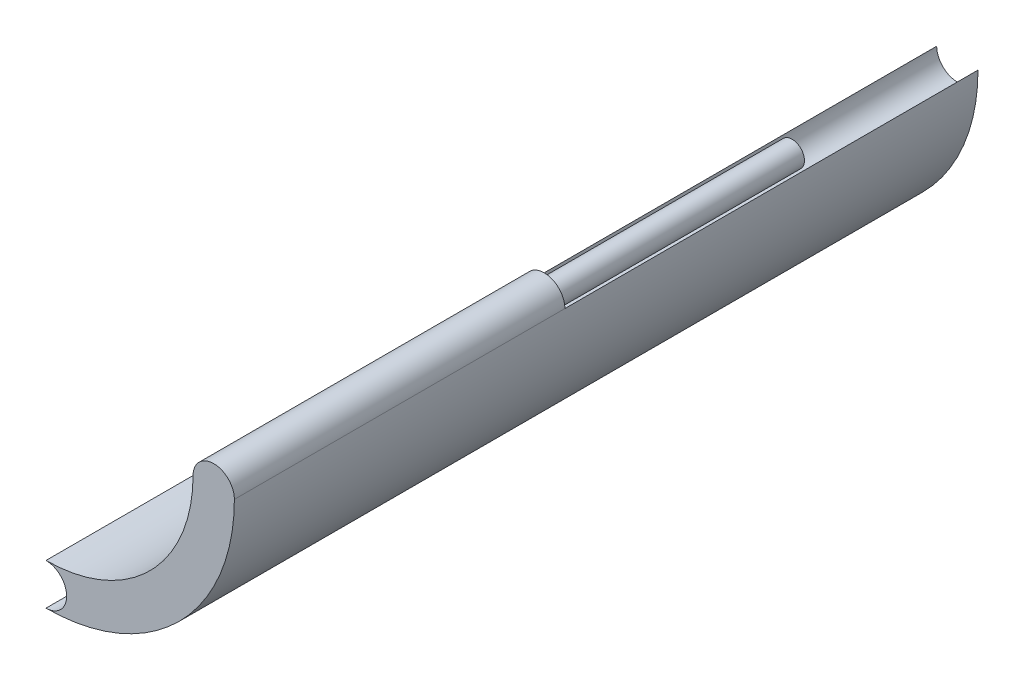
ISO-10303-21;
HEADER;
FILE_DESCRIPTION(('STEP AP214'),'2;1');
FILE_NAME('part.step','',(''),(''),'','','');
FILE_SCHEMA(('AUTOMOTIVE_DESIGN { 1 0 10303 214 1 1 1 1 }'));
ENDSEC;
DATA;
#1=APPLICATION_CONTEXT('core data for automotive mechanical design processes');
#2=APPLICATION_PROTOCOL_DEFINITION('international standard','automotive_design',2000,#1);
#3=PRODUCT_CONTEXT('',#1,'mechanical');
#4=PRODUCT('Part','Part','',(#3));
#5=PRODUCT_RELATED_PRODUCT_CATEGORY('part','',(#4));
#6=PRODUCT_DEFINITION_FORMATION('','',#4);
#7=PRODUCT_DEFINITION_CONTEXT('part definition',#1,'design');
#8=PRODUCT_DEFINITION('design','',#6,#7);
#9=PRODUCT_DEFINITION_SHAPE('','',#8);
#10=(LENGTH_UNIT() NAMED_UNIT(*) SI_UNIT(.MILLI.,.METRE.));
#11=(NAMED_UNIT(*) PLANE_ANGLE_UNIT() SI_UNIT($,.RADIAN.));
#12=(NAMED_UNIT(*) SI_UNIT($,.STERADIAN.) SOLID_ANGLE_UNIT());
#13=UNCERTAINTY_MEASURE_WITH_UNIT(LENGTH_MEASURE(1.E-05),#10,'distance_accuracy_value','');
#14=(GEOMETRIC_REPRESENTATION_CONTEXT(3) GLOBAL_UNCERTAINTY_ASSIGNED_CONTEXT((#13)) GLOBAL_UNIT_ASSIGNED_CONTEXT((#10,
#11,#12)) REPRESENTATION_CONTEXT('',''));
#15=CARTESIAN_POINT('',(0.,0.,0.));
#16=DIRECTION('',(0.,0.,1.));
#17=DIRECTION('',(1.,0.,0.));
#18=AXIS2_PLACEMENT_3D('',#15,#16,#17);
#19=CARTESIAN_POINT('',(101.5,0.,-450.));
#20=DIRECTION('',(0.,0.,1.));
#21=DIRECTION('',(1.,0.,0.));
#22=AXIS2_PLACEMENT_3D('',#19,#20,#21);
#23=CYLINDRICAL_SURFACE('',#22,12.5);
#24=CARTESIAN_POINT('',(101.5,0.,-200.));
#25=DIRECTION('',(0.,0.,1.));
#26=DIRECTION('',(1.,0.,0.));
#27=AXIS2_PLACEMENT_3D('',#24,#25,#26);
#28=CIRCLE('',#27,12.5);
#29=CARTESIAN_POINT('',(89.,0.,-200.));
#30=VERTEX_POINT('',#29);
#31=CARTESIAN_POINT('',(114.,0.,-200.));
#32=VERTEX_POINT('',#31);
#33=EDGE_CURVE('E60',#30,#32,#28,.T.);
#34=ORIENTED_EDGE('',*,*,#33,.T.);
#35=DIRECTION('',(0.,0.,1.));
#36=VECTOR('',#35,1.);
#37=CARTESIAN_POINT('',(114.,0.,-450.));
#38=LINE('',#37,#36);
#39=CARTESIAN_POINT('',(114.,0.,-450.));
#40=VERTEX_POINT('',#39);
#41=EDGE_CURVE('E11',#40,#32,#38,.T.);
#42=ORIENTED_EDGE('',*,*,#41,.F.);
#43=CARTESIAN_POINT('',(101.5,0.,-450.));
#44=DIRECTION('',(0.,0.,1.));
#45=DIRECTION('',(1.,0.,0.));
#46=AXIS2_PLACEMENT_3D('',#43,#44,#45);
#47=CIRCLE('',#46,12.5);
#48=CARTESIAN_POINT('',(89.,0.,-450.));
#49=VERTEX_POINT('',#48);
#50=EDGE_CURVE('E97',#49,#40,#47,.T.);
#51=ORIENTED_EDGE('',*,*,#50,.F.);
#52=DIRECTION('',(0.,0.,1.));
#53=VECTOR('',#52,1.);
#54=CARTESIAN_POINT('',(89.,0.,-450.));
#55=LINE('',#54,#53);
#56=EDGE_CURVE('E42',#49,#30,#55,.T.);
#57=ORIENTED_EDGE('',*,*,#56,.T.);
#58=EDGE_LOOP('',(#34,#42,#51,#57));
#59=FACE_BOUND('',#58,.T.);
#60=ADVANCED_FACE('F41',(#59),#23,.F.);
#61=CARTESIAN_POINT('',(0.,0.,-450.));
#62=DIRECTION('',(0.,0.,1.));
#63=DIRECTION('',(1.,0.,0.));
#64=AXIS2_PLACEMENT_3D('',#61,#62,#63);
#65=CYLINDRICAL_SURFACE('',#64,114.);
#66=CARTESIAN_POINT('',(0.,0.,0.));
#67=DIRECTION('',(0.,0.,1.));
#68=DIRECTION('',(1.,0.,0.));
#69=AXIS2_PLACEMENT_3D('',#66,#67,#68);
#70=CIRCLE('',#69,114.);
#71=CARTESIAN_POINT('',(0.,-114.,0.));
#72=VERTEX_POINT('',#71);
#73=CARTESIAN_POINT('',(114.,0.,0.));
#74=VERTEX_POINT('',#73);
#75=EDGE_CURVE('E93',#72,#74,#70,.T.);
#76=ORIENTED_EDGE('',*,*,#75,.F.);
#77=DIRECTION('',(0.,0.,1.));
#78=VECTOR('',#77,1.);
#79=CARTESIAN_POINT('',(0.,-114.,-450.));
#80=LINE('',#79,#78);
#81=CARTESIAN_POINT('',(0.,-114.,-450.));
#82=VERTEX_POINT('',#81);
#83=EDGE_CURVE('E47',#82,#72,#80,.T.);
#84=ORIENTED_EDGE('',*,*,#83,.F.);
#85=CARTESIAN_POINT('',(0.,0.,-450.));
#86=DIRECTION('',(0.,0.,1.));
#87=DIRECTION('',(1.,0.,0.));
#88=AXIS2_PLACEMENT_3D('',#85,#86,#87);
#89=CIRCLE('',#88,114.);
#90=EDGE_CURVE('E124',#82,#40,#89,.T.);
#91=ORIENTED_EDGE('',*,*,#90,.T.);
#92=ORIENTED_EDGE('',*,*,#41,.T.);
#93=DIRECTION('',(0.,0.,1.));
#94=VECTOR('',#93,1.);
#95=CARTESIAN_POINT('',(114.,0.,-100.));
#96=LINE('',#95,#94);
#97=EDGE_CURVE('E105',#32,#74,#96,.T.);
#98=ORIENTED_EDGE('',*,*,#97,.T.);
#99=EDGE_LOOP('',(#76,#84,#91,#92,#98));
#100=FACE_BOUND('',#99,.T.);
#101=ADVANCED_FACE('F103',(#100),#65,.T.);
#102=CARTESIAN_POINT('',(0.,-101.5,-450.));
#103=DIRECTION('',(0.,0.,1.));
#104=DIRECTION('',(1.,0.,0.));
#105=AXIS2_PLACEMENT_3D('',#102,#103,#104);
#106=CYLINDRICAL_SURFACE('',#105,12.5);
#107=CARTESIAN_POINT('',(0.,-101.5,0.));
#108=DIRECTION('',(0.,0.,1.));
#109=DIRECTION('',(1.,0.,0.));
#110=AXIS2_PLACEMENT_3D('',#107,#108,#109);
#111=CIRCLE('',#110,12.5);
#112=CARTESIAN_POINT('',(0.,-89.,0.));
#113=VERTEX_POINT('',#112);
#114=EDGE_CURVE('E100',#72,#113,#111,.T.);
#115=ORIENTED_EDGE('',*,*,#114,.T.);
#116=DIRECTION('',(0.,0.,1.));
#117=VECTOR('',#116,1.);
#118=CARTESIAN_POINT('',(0.,-89.,-450.));
#119=LINE('',#118,#117);
#120=CARTESIAN_POINT('',(0.,-89.,-450.));
#121=VERTEX_POINT('',#120);
#122=EDGE_CURVE('E129',#121,#113,#119,.T.);
#123=ORIENTED_EDGE('',*,*,#122,.F.);
#124=CARTESIAN_POINT('',(0.,-101.5,-450.));
#125=DIRECTION('',(0.,0.,1.));
#126=DIRECTION('',(1.,0.,0.));
#127=AXIS2_PLACEMENT_3D('',#124,#125,#126);
#128=CIRCLE('',#127,12.5);
#129=EDGE_CURVE('E122',#82,#121,#128,.T.);
#130=ORIENTED_EDGE('',*,*,#129,.F.);
#131=ORIENTED_EDGE('',*,*,#83,.T.);
#132=EDGE_LOOP('',(#115,#123,#130,#131));
#133=FACE_BOUND('',#132,.T.);
#134=ADVANCED_FACE('F152',(#133),#106,.F.);
#135=CARTESIAN_POINT('',(0.,0.,-450.));
#136=DIRECTION('',(0.,0.,1.));
#137=DIRECTION('',(1.,0.,0.));
#138=AXIS2_PLACEMENT_3D('',#135,#136,#137);
#139=CYLINDRICAL_SURFACE('',#138,89.);
#140=CARTESIAN_POINT('',(0.,0.,0.));
#141=DIRECTION('',(0.,0.,1.));
#142=DIRECTION('',(1.,0.,0.));
#143=AXIS2_PLACEMENT_3D('',#140,#141,#142);
#144=CIRCLE('',#143,89.);
#145=CARTESIAN_POINT('',(89.,0.,0.));
#146=VERTEX_POINT('',#145);
#147=EDGE_CURVE('E107',#113,#146,#144,.T.);
#148=ORIENTED_EDGE('',*,*,#147,.T.);
#149=DIRECTION('',(0.,0.,1.));
#150=VECTOR('',#149,1.);
#151=CARTESIAN_POINT('',(89.,0.,-100.));
#152=LINE('',#151,#150);
#153=EDGE_CURVE('E61',#30,#146,#152,.T.);
#154=ORIENTED_EDGE('',*,*,#153,.F.);
#155=ORIENTED_EDGE('',*,*,#56,.F.);
#156=CARTESIAN_POINT('',(0.,0.,-450.));
#157=DIRECTION('',(0.,0.,1.));
#158=DIRECTION('',(1.,0.,0.));
#159=AXIS2_PLACEMENT_3D('',#156,#157,#158);
#160=CIRCLE('',#159,89.);
#161=EDGE_CURVE('E121',#121,#49,#160,.T.);
#162=ORIENTED_EDGE('',*,*,#161,.F.);
#163=ORIENTED_EDGE('',*,*,#122,.T.);
#164=EDGE_LOOP('',(#148,#154,#155,#162,#163));
#165=FACE_BOUND('',#164,.T.);
#166=ADVANCED_FACE('F159',(#165),#139,.F.);
#167=CARTESIAN_POINT('',(0.,0.,-450.));
#168=DIRECTION('',(0.,0.,1.));
#169=DIRECTION('',(1.,0.,0.));
#170=AXIS2_PLACEMENT_3D('',#167,#168,#169);
#171=PLANE('',#170);
#172=ORIENTED_EDGE('',*,*,#50,.T.);
#173=ORIENTED_EDGE('',*,*,#90,.F.);
#174=ORIENTED_EDGE('',*,*,#129,.T.);
#175=ORIENTED_EDGE('',*,*,#161,.T.);
#176=EDGE_LOOP('',(#172,#173,#174,#175));
#177=FACE_BOUND('',#176,.T.);
#178=ADVANCED_FACE('F164',(#177),#171,.F.);
#179=CARTESIAN_POINT('',(0.,0.,0.));
#180=DIRECTION('',(0.,0.,1.));
#181=DIRECTION('',(1.,0.,0.));
#182=AXIS2_PLACEMENT_3D('',#179,#180,#181);
#183=PLANE('',#182);
#184=ORIENTED_EDGE('',*,*,#75,.T.);
#185=CARTESIAN_POINT('',(101.5,0.,0.));
#186=DIRECTION('',(0.,0.,1.));
#187=DIRECTION('',(1.,0.,0.));
#188=AXIS2_PLACEMENT_3D('',#185,#186,#187);
#189=CIRCLE('',#188,12.5);
#190=EDGE_CURVE('E96',#74,#146,#189,.T.);
#191=ORIENTED_EDGE('',*,*,#190,.T.);
#192=ORIENTED_EDGE('',*,*,#147,.F.);
#193=ORIENTED_EDGE('',*,*,#114,.F.);
#194=EDGE_LOOP('',(#184,#191,#192,#193));
#195=FACE_BOUND('',#194,.T.);
#196=ADVANCED_FACE('F91',(#195),#183,.T.);
#197=CARTESIAN_POINT('',(101.5,0.,-200.));
#198=DIRECTION('',(0.,0.,1.));
#199=DIRECTION('',(1.,0.,0.));
#200=AXIS2_PLACEMENT_3D('',#197,#198,#199);
#201=CYLINDRICAL_SURFACE('',#200,12.5);
#202=ORIENTED_EDGE('',*,*,#97,.F.);
#203=EDGE_CURVE('E114',#32,#30,#28,.T.);
#204=ORIENTED_EDGE('',*,*,#203,.T.);
#205=ORIENTED_EDGE('',*,*,#153,.T.);
#206=ORIENTED_EDGE('',*,*,#190,.F.);
#207=EDGE_LOOP('',(#202,#204,#205,#206));
#208=FACE_BOUND('',#207,.T.);
#209=ADVANCED_FACE('F109',(#208),#201,.T.);
#210=CARTESIAN_POINT('',(0.,0.,-200.));
#211=DIRECTION('',(0.,0.,1.));
#212=DIRECTION('',(1.,0.,0.));
#213=AXIS2_PLACEMENT_3D('',#210,#211,#212);
#214=PLANE('',#213);
#215=CARTESIAN_POINT('',(101.5,0.,-200.));
#216=DIRECTION('',(0.,0.,1.));
#217=DIRECTION('',(1.,0.,0.));
#218=AXIS2_PLACEMENT_3D('',#215,#216,#217);
#219=CIRCLE('',#218,7.50000000000001);
#220=CARTESIAN_POINT('',(109.,0.,-200.));
#221=VERTEX_POINT('',#220);
#222=EDGE_CURVE('E112',#221,#221,#219,.T.);
#223=ORIENTED_EDGE('',*,*,#222,.T.);
#224=EDGE_LOOP('',(#223));
#225=FACE_BOUND('',#224,.T.);
#226=ORIENTED_EDGE('',*,*,#203,.F.);
#227=ORIENTED_EDGE('',*,*,#33,.F.);
#228=EDGE_LOOP('',(#226,#227));
#229=FACE_BOUND('',#228,.T.);
#230=ADVANCED_FACE('F133',(#225,#229),#214,.F.);
#231=CARTESIAN_POINT('',(0.,0.,-350.));
#232=DIRECTION('',(0.,0.,1.));
#233=DIRECTION('',(1.,0.,0.));
#234=AXIS2_PLACEMENT_3D('',#231,#232,#233);
#235=PLANE('',#234);
#236=CARTESIAN_POINT('',(101.5,0.,-350.));
#237=DIRECTION('',(0.,0.,1.));
#238=DIRECTION('',(1.,0.,0.));
#239=AXIS2_PLACEMENT_3D('',#236,#237,#238);
#240=CIRCLE('',#239,7.50000000000001);
#241=CARTESIAN_POINT('',(109.,0.,-350.));
#242=VERTEX_POINT('',#241);
#243=EDGE_CURVE('E117',#242,#242,#240,.T.);
#244=ORIENTED_EDGE('',*,*,#243,.F.);
#245=EDGE_LOOP('',(#244));
#246=FACE_BOUND('',#245,.T.);
#247=ADVANCED_FACE('F140',(#246),#235,.F.);
#248=CARTESIAN_POINT('',(101.5,0.,-350.));
#249=DIRECTION('',(0.,0.,1.));
#250=DIRECTION('',(1.,0.,0.));
#251=AXIS2_PLACEMENT_3D('',#248,#249,#250);
#252=CYLINDRICAL_SURFACE('',#251,7.50000000000001);
#253=ORIENTED_EDGE('',*,*,#243,.T.);
#254=EDGE_LOOP('',(#253));
#255=FACE_BOUND('',#254,.T.);
#256=ORIENTED_EDGE('',*,*,#222,.F.);
#257=EDGE_LOOP('',(#256));
#258=FACE_BOUND('',#257,.T.);
#259=ADVANCED_FACE('F145',(#255,#258),#252,.T.);
#260=CLOSED_SHELL('',(#60,#101,#134,#166,#178,#196,#209,#230,#247,#259));
#261=MANIFOLD_SOLID_BREP('B2',#260);
#262=ADVANCED_BREP_SHAPE_REPRESENTATION('',(#18,#261),#14);
#263=SHAPE_DEFINITION_REPRESENTATION(#9,#262);
ENDSEC;
END-ISO-10303-21;
